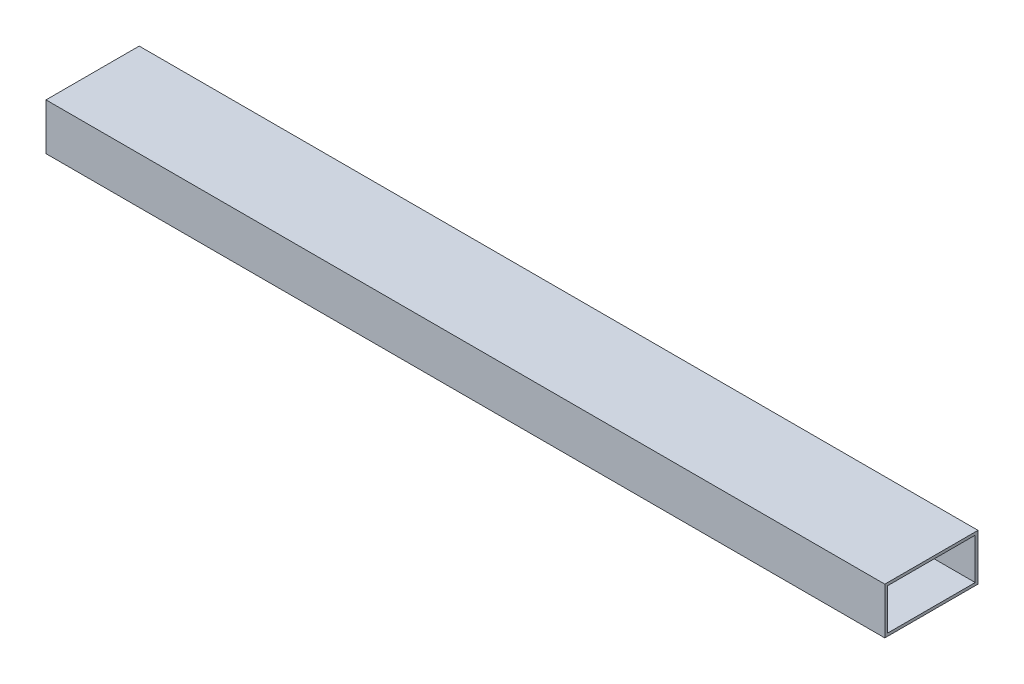
ISO-10303-21;
HEADER;
FILE_DESCRIPTION(('STEP AP214'),'2;1');
FILE_NAME('part.step','',(''),(''),'','','');
FILE_SCHEMA(('AUTOMOTIVE_DESIGN { 1 0 10303 214 1 1 1 1 }'));
ENDSEC;
DATA;
#1=APPLICATION_CONTEXT('core data for automotive mechanical design processes');
#2=APPLICATION_PROTOCOL_DEFINITION('international standard','automotive_design',2000,#1);
#3=PRODUCT_CONTEXT('',#1,'mechanical');
#4=PRODUCT('Part','Part','',(#3));
#5=PRODUCT_RELATED_PRODUCT_CATEGORY('part','',(#4));
#6=PRODUCT_DEFINITION_FORMATION('','',#4);
#7=PRODUCT_DEFINITION_CONTEXT('part definition',#1,'design');
#8=PRODUCT_DEFINITION('design','',#6,#7);
#9=PRODUCT_DEFINITION_SHAPE('','',#8);
#10=(LENGTH_UNIT() NAMED_UNIT(*) SI_UNIT(.MILLI.,.METRE.));
#11=(NAMED_UNIT(*) PLANE_ANGLE_UNIT() SI_UNIT($,.RADIAN.));
#12=(NAMED_UNIT(*) SI_UNIT($,.STERADIAN.) SOLID_ANGLE_UNIT());
#13=UNCERTAINTY_MEASURE_WITH_UNIT(LENGTH_MEASURE(1.E-05),#10,'distance_accuracy_value','');
#14=(GEOMETRIC_REPRESENTATION_CONTEXT(3) GLOBAL_UNCERTAINTY_ASSIGNED_CONTEXT((#13)) GLOBAL_UNIT_ASSIGNED_CONTEXT((#10,
#11,#12)) REPRESENTATION_CONTEXT('',''));
#15=CARTESIAN_POINT('',(0.,0.,0.));
#16=DIRECTION('',(0.,0.,1.));
#17=DIRECTION('',(1.,0.,0.));
#18=AXIS2_PLACEMENT_3D('',#15,#16,#17);
#19=CARTESIAN_POINT('',(457.2,0.,0.));
#20=DIRECTION('',(1.,0.,0.));
#21=DIRECTION('',(0.,0.,-1.));
#22=AXIS2_PLACEMENT_3D('',#19,#20,#21);
#23=PLANE('',#22);
#24=DIRECTION('',(0.,1.,0.));
#25=VECTOR('',#24,1.);
#26=CARTESIAN_POINT('',(457.2,0.,0.));
#27=LINE('',#26,#25);
#28=CARTESIAN_POINT('',(457.2,0.,0.));
#29=VERTEX_POINT('',#28);
#30=CARTESIAN_POINT('',(457.2,25.4,0.));
#31=VERTEX_POINT('',#30);
#32=EDGE_CURVE('E159',#29,#31,#27,.T.);
#33=ORIENTED_EDGE('',*,*,#32,.T.);
#34=DIRECTION('',(0.,0.,1.));
#35=VECTOR('',#34,1.);
#36=CARTESIAN_POINT('',(457.2,25.4,0.));
#37=LINE('',#36,#35);
#38=CARTESIAN_POINT('',(457.2,25.4,50.8));
#39=VERTEX_POINT('',#38);
#40=EDGE_CURVE('E162',#31,#39,#37,.T.);
#41=ORIENTED_EDGE('',*,*,#40,.T.);
#42=DIRECTION('',(0.,-1.,0.));
#43=VECTOR('',#42,1.);
#44=CARTESIAN_POINT('',(457.2,0.,50.8));
#45=LINE('',#44,#43);
#46=CARTESIAN_POINT('',(457.2,0.,50.8));
#47=VERTEX_POINT('',#46);
#48=EDGE_CURVE('E165',#39,#47,#45,.T.);
#49=ORIENTED_EDGE('',*,*,#48,.T.);
#50=DIRECTION('',(0.,0.,-1.));
#51=VECTOR('',#50,1.);
#52=CARTESIAN_POINT('',(457.2,0.,0.));
#53=LINE('',#52,#51);
#54=EDGE_CURVE('E167',#47,#29,#53,.T.);
#55=ORIENTED_EDGE('',*,*,#54,.T.);
#56=EDGE_LOOP('',(#33,#41,#49,#55));
#57=FACE_BOUND('',#56,.T.);
#58=DIRECTION('',(0.,0.,1.));
#59=VECTOR('',#58,1.);
#60=CARTESIAN_POINT('',(457.2,23.876,0.));
#61=LINE('',#60,#59);
#62=CARTESIAN_POINT('',(457.2,23.876,1.524));
#63=VERTEX_POINT('',#62);
#64=CARTESIAN_POINT('',(457.2,23.876,49.276));
#65=VERTEX_POINT('',#64);
#66=EDGE_CURVE('E131',#63,#65,#61,.T.);
#67=ORIENTED_EDGE('',*,*,#66,.F.);
#68=DIRECTION('',(0.,1.,0.));
#69=VECTOR('',#68,1.);
#70=CARTESIAN_POINT('',(457.2,0.,1.524));
#71=LINE('',#70,#69);
#72=CARTESIAN_POINT('',(457.2,1.524,1.524));
#73=VERTEX_POINT('',#72);
#74=EDGE_CURVE('E123',#73,#63,#71,.T.);
#75=ORIENTED_EDGE('',*,*,#74,.F.);
#76=DIRECTION('',(0.,0.,-1.));
#77=VECTOR('',#76,1.);
#78=CARTESIAN_POINT('',(457.2,1.524,0.));
#79=LINE('',#78,#77);
#80=CARTESIAN_POINT('',(457.2,1.524,49.276));
#81=VERTEX_POINT('',#80);
#82=EDGE_CURVE('E145',#81,#73,#79,.T.);
#83=ORIENTED_EDGE('',*,*,#82,.F.);
#84=DIRECTION('',(0.,-1.,0.));
#85=VECTOR('',#84,1.);
#86=CARTESIAN_POINT('',(457.2,0.,49.276));
#87=LINE('',#86,#85);
#88=EDGE_CURVE('E143',#65,#81,#87,.T.);
#89=ORIENTED_EDGE('',*,*,#88,.F.);
#90=EDGE_LOOP('',(#67,#75,#83,#89));
#91=FACE_BOUND('',#90,.T.);
#92=ADVANCED_FACE('F58',(#57,#91),#23,.T.);
#93=CARTESIAN_POINT('',(0.,0.,0.));
#94=DIRECTION('',(1.,0.,0.));
#95=DIRECTION('',(0.,0.,-1.));
#96=AXIS2_PLACEMENT_3D('',#93,#94,#95);
#97=PLANE('',#96);
#98=DIRECTION('',(0.,1.,0.));
#99=VECTOR('',#98,1.);
#100=CARTESIAN_POINT('',(0.,0.,0.));
#101=LINE('',#100,#99);
#102=CARTESIAN_POINT('',(0.,0.,0.));
#103=VERTEX_POINT('',#102);
#104=CARTESIAN_POINT('',(0.,25.4,0.));
#105=VERTEX_POINT('',#104);
#106=EDGE_CURVE('E139',#103,#105,#101,.T.);
#107=ORIENTED_EDGE('',*,*,#106,.F.);
#108=DIRECTION('',(0.,0.,-1.));
#109=VECTOR('',#108,1.);
#110=CARTESIAN_POINT('',(0.,0.,0.));
#111=LINE('',#110,#109);
#112=CARTESIAN_POINT('',(0.,0.,50.8));
#113=VERTEX_POINT('',#112);
#114=EDGE_CURVE('E163',#113,#103,#111,.T.);
#115=ORIENTED_EDGE('',*,*,#114,.F.);
#116=DIRECTION('',(0.,-1.,0.));
#117=VECTOR('',#116,1.);
#118=CARTESIAN_POINT('',(0.,0.,50.8));
#119=LINE('',#118,#117);
#120=CARTESIAN_POINT('',(0.,25.4,50.8));
#121=VERTEX_POINT('',#120);
#122=EDGE_CURVE('E174',#121,#113,#119,.T.);
#123=ORIENTED_EDGE('',*,*,#122,.F.);
#124=DIRECTION('',(0.,0.,1.));
#125=VECTOR('',#124,1.);
#126=CARTESIAN_POINT('',(0.,25.4,0.));
#127=LINE('',#126,#125);
#128=EDGE_CURVE('E172',#105,#121,#127,.T.);
#129=ORIENTED_EDGE('',*,*,#128,.F.);
#130=EDGE_LOOP('',(#107,#115,#123,#129));
#131=FACE_BOUND('',#130,.T.);
#132=DIRECTION('',(0.,1.,0.));
#133=VECTOR('',#132,1.);
#134=CARTESIAN_POINT('',(0.,0.,1.524));
#135=LINE('',#134,#133);
#136=CARTESIAN_POINT('',(0.,1.524,1.524));
#137=VERTEX_POINT('',#136);
#138=CARTESIAN_POINT('',(0.,23.876,1.524));
#139=VERTEX_POINT('',#138);
#140=EDGE_CURVE('E81',#137,#139,#135,.T.);
#141=ORIENTED_EDGE('',*,*,#140,.T.);
#142=DIRECTION('',(0.,0.,1.));
#143=VECTOR('',#142,1.);
#144=CARTESIAN_POINT('',(0.,23.876,0.));
#145=LINE('',#144,#143);
#146=CARTESIAN_POINT('',(0.,23.876,49.276));
#147=VERTEX_POINT('',#146);
#148=EDGE_CURVE('E138',#139,#147,#145,.T.);
#149=ORIENTED_EDGE('',*,*,#148,.T.);
#150=DIRECTION('',(0.,-1.,0.));
#151=VECTOR('',#150,1.);
#152=CARTESIAN_POINT('',(0.,0.,49.276));
#153=LINE('',#152,#151);
#154=CARTESIAN_POINT('',(0.,1.524,49.276));
#155=VERTEX_POINT('',#154);
#156=EDGE_CURVE('E151',#147,#155,#153,.T.);
#157=ORIENTED_EDGE('',*,*,#156,.T.);
#158=DIRECTION('',(0.,0.,-1.));
#159=VECTOR('',#158,1.);
#160=CARTESIAN_POINT('',(0.,1.524,0.));
#161=LINE('',#160,#159);
#162=EDGE_CURVE('E132',#155,#137,#161,.T.);
#163=ORIENTED_EDGE('',*,*,#162,.T.);
#164=EDGE_LOOP('',(#141,#149,#157,#163));
#165=FACE_BOUND('',#164,.T.);
#166=ADVANCED_FACE('F192',(#131,#165),#97,.F.);
#167=CARTESIAN_POINT('',(457.2,0.,0.));
#168=DIRECTION('',(0.,0.,1.));
#169=DIRECTION('',(0.,-1.,0.));
#170=AXIS2_PLACEMENT_3D('',#167,#168,#169);
#171=PLANE('',#170);
#172=ORIENTED_EDGE('',*,*,#106,.T.);
#173=DIRECTION('',(-1.,0.,0.));
#174=VECTOR('',#173,1.);
#175=CARTESIAN_POINT('',(457.2,25.4,0.));
#176=LINE('',#175,#174);
#177=EDGE_CURVE('E12',#31,#105,#176,.T.);
#178=ORIENTED_EDGE('',*,*,#177,.F.);
#179=ORIENTED_EDGE('',*,*,#32,.F.);
#180=DIRECTION('',(-1.,0.,0.));
#181=VECTOR('',#180,1.);
#182=CARTESIAN_POINT('',(457.2,0.,0.));
#183=LINE('',#182,#181);
#184=EDGE_CURVE('E169',#29,#103,#183,.T.);
#185=ORIENTED_EDGE('',*,*,#184,.T.);
#186=EDGE_LOOP('',(#172,#178,#179,#185));
#187=FACE_BOUND('',#186,.T.);
#188=ADVANCED_FACE('F60',(#187),#171,.F.);
#189=CARTESIAN_POINT('',(457.2,25.4,0.));
#190=DIRECTION('',(0.,-1.,0.));
#191=DIRECTION('',(0.,0.,-1.));
#192=AXIS2_PLACEMENT_3D('',#189,#190,#191);
#193=PLANE('',#192);
#194=ORIENTED_EDGE('',*,*,#128,.T.);
#195=DIRECTION('',(-1.,0.,0.));
#196=VECTOR('',#195,1.);
#197=CARTESIAN_POINT('',(457.2,25.4,50.8));
#198=LINE('',#197,#196);
#199=EDGE_CURVE('E66',#39,#121,#198,.T.);
#200=ORIENTED_EDGE('',*,*,#199,.F.);
#201=ORIENTED_EDGE('',*,*,#40,.F.);
#202=ORIENTED_EDGE('',*,*,#177,.T.);
#203=EDGE_LOOP('',(#194,#200,#201,#202));
#204=FACE_BOUND('',#203,.T.);
#205=ADVANCED_FACE('F202',(#204),#193,.F.);
#206=CARTESIAN_POINT('',(457.2,0.,50.8));
#207=DIRECTION('',(0.,0.,-1.));
#208=DIRECTION('',(-1.,0.,0.));
#209=AXIS2_PLACEMENT_3D('',#206,#207,#208);
#210=PLANE('',#209);
#211=ORIENTED_EDGE('',*,*,#122,.T.);
#212=DIRECTION('',(-1.,0.,0.));
#213=VECTOR('',#212,1.);
#214=CARTESIAN_POINT('',(457.2,0.,50.8));
#215=LINE('',#214,#213);
#216=EDGE_CURVE('E179',#47,#113,#215,.T.);
#217=ORIENTED_EDGE('',*,*,#216,.F.);
#218=ORIENTED_EDGE('',*,*,#48,.F.);
#219=ORIENTED_EDGE('',*,*,#199,.T.);
#220=EDGE_LOOP('',(#211,#217,#218,#219));
#221=FACE_BOUND('',#220,.T.);
#222=ADVANCED_FACE('F186',(#221),#210,.F.);
#223=CARTESIAN_POINT('',(457.2,0.,0.));
#224=DIRECTION('',(0.,1.,0.));
#225=DIRECTION('',(0.,0.,1.));
#226=AXIS2_PLACEMENT_3D('',#223,#224,#225);
#227=PLANE('',#226);
#228=ORIENTED_EDGE('',*,*,#114,.T.);
#229=ORIENTED_EDGE('',*,*,#184,.F.);
#230=ORIENTED_EDGE('',*,*,#54,.F.);
#231=ORIENTED_EDGE('',*,*,#216,.T.);
#232=EDGE_LOOP('',(#228,#229,#230,#231));
#233=FACE_BOUND('',#232,.T.);
#234=ADVANCED_FACE('F196',(#233),#227,.F.);
#235=CARTESIAN_POINT('',(457.2,0.,1.524));
#236=DIRECTION('',(0.,0.,1.));
#237=DIRECTION('',(0.,-1.,0.));
#238=AXIS2_PLACEMENT_3D('',#235,#236,#237);
#239=PLANE('',#238);
#240=ORIENTED_EDGE('',*,*,#140,.F.);
#241=DIRECTION('',(-1.,0.,0.));
#242=VECTOR('',#241,1.);
#243=CARTESIAN_POINT('',(457.2,1.524,1.524));
#244=LINE('',#243,#242);
#245=EDGE_CURVE('E127',#73,#137,#244,.T.);
#246=ORIENTED_EDGE('',*,*,#245,.F.);
#247=ORIENTED_EDGE('',*,*,#74,.T.);
#248=DIRECTION('',(-1.,0.,0.));
#249=VECTOR('',#248,1.);
#250=CARTESIAN_POINT('',(457.2,23.876,1.524));
#251=LINE('',#250,#249);
#252=EDGE_CURVE('E126',#63,#139,#251,.T.);
#253=ORIENTED_EDGE('',*,*,#252,.T.);
#254=EDGE_LOOP('',(#240,#246,#247,#253));
#255=FACE_BOUND('',#254,.T.);
#256=ADVANCED_FACE('F125',(#255),#239,.T.);
#257=CARTESIAN_POINT('',(457.2,23.876,0.));
#258=DIRECTION('',(0.,-1.,0.));
#259=DIRECTION('',(0.,0.,-1.));
#260=AXIS2_PLACEMENT_3D('',#257,#258,#259);
#261=PLANE('',#260);
#262=ORIENTED_EDGE('',*,*,#148,.F.);
#263=ORIENTED_EDGE('',*,*,#252,.F.);
#264=ORIENTED_EDGE('',*,*,#66,.T.);
#265=DIRECTION('',(-1.,0.,0.));
#266=VECTOR('',#265,1.);
#267=CARTESIAN_POINT('',(457.2,23.876,49.276));
#268=LINE('',#267,#266);
#269=EDGE_CURVE('E140',#65,#147,#268,.T.);
#270=ORIENTED_EDGE('',*,*,#269,.T.);
#271=EDGE_LOOP('',(#262,#263,#264,#270));
#272=FACE_BOUND('',#271,.T.);
#273=ADVANCED_FACE('F135',(#272),#261,.T.);
#274=CARTESIAN_POINT('',(457.2,0.,49.276));
#275=DIRECTION('',(0.,0.,-1.));
#276=DIRECTION('',(-1.,0.,0.));
#277=AXIS2_PLACEMENT_3D('',#274,#275,#276);
#278=PLANE('',#277);
#279=ORIENTED_EDGE('',*,*,#156,.F.);
#280=ORIENTED_EDGE('',*,*,#269,.F.);
#281=ORIENTED_EDGE('',*,*,#88,.T.);
#282=DIRECTION('',(-1.,0.,0.));
#283=VECTOR('',#282,1.);
#284=CARTESIAN_POINT('',(457.2,1.524,49.276));
#285=LINE('',#284,#283);
#286=EDGE_CURVE('E73',#81,#155,#285,.T.);
#287=ORIENTED_EDGE('',*,*,#286,.T.);
#288=EDGE_LOOP('',(#279,#280,#281,#287));
#289=FACE_BOUND('',#288,.T.);
#290=ADVANCED_FACE('F225',(#289),#278,.T.);
#291=CARTESIAN_POINT('',(457.2,1.524,0.));
#292=DIRECTION('',(0.,1.,0.));
#293=DIRECTION('',(0.,0.,1.));
#294=AXIS2_PLACEMENT_3D('',#291,#292,#293);
#295=PLANE('',#294);
#296=ORIENTED_EDGE('',*,*,#162,.F.);
#297=ORIENTED_EDGE('',*,*,#286,.F.);
#298=ORIENTED_EDGE('',*,*,#82,.T.);
#299=ORIENTED_EDGE('',*,*,#245,.T.);
#300=EDGE_LOOP('',(#296,#297,#298,#299));
#301=FACE_BOUND('',#300,.T.);
#302=ADVANCED_FACE('F229',(#301),#295,.T.);
#303=CLOSED_SHELL('',(#92,#166,#188,#205,#222,#234,#256,#273,#290,#302));
#304=MANIFOLD_SOLID_BREP('B2',#303);
#305=ADVANCED_BREP_SHAPE_REPRESENTATION('',(#18,#304),#14);
#306=SHAPE_DEFINITION_REPRESENTATION(#9,#305);
ENDSEC;
END-ISO-10303-21;
